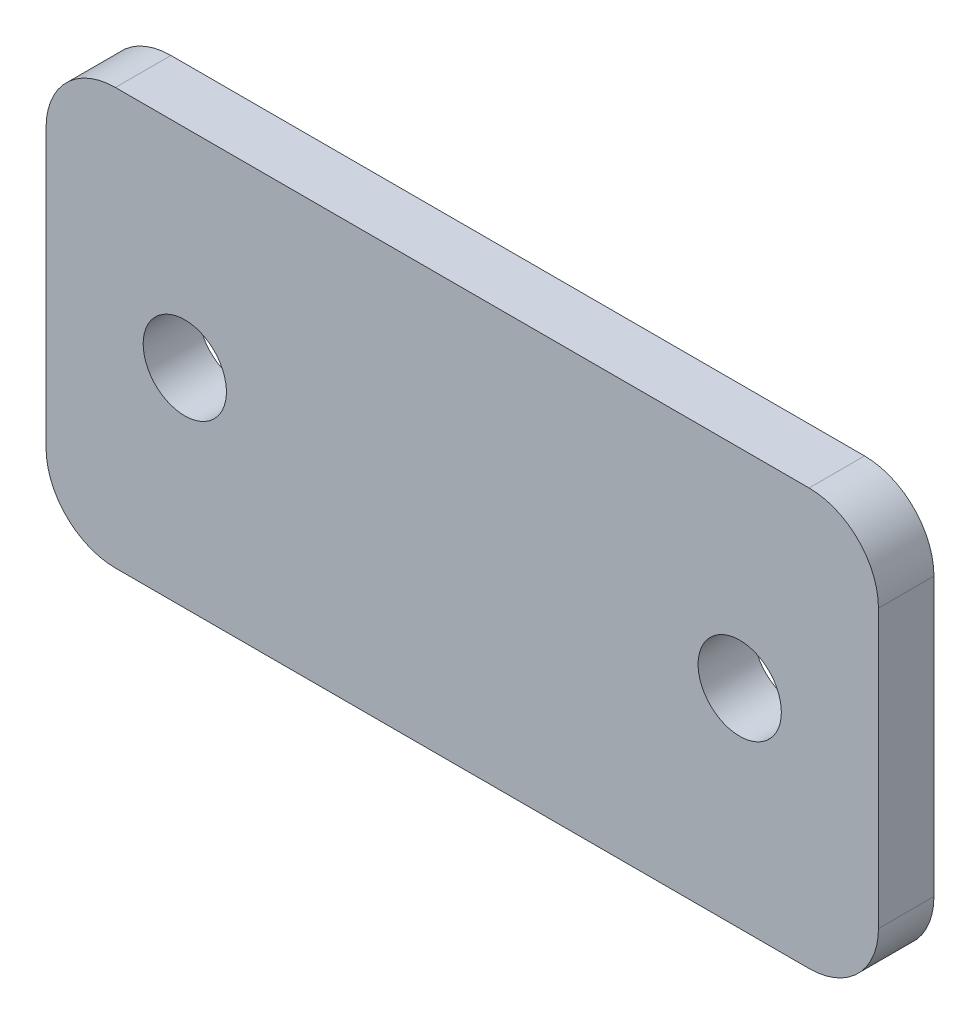
ISO-10303-21;
HEADER;
FILE_DESCRIPTION(('STEP AP214'),'2;1');
FILE_NAME('part.step','',(''),(''),'','','');
FILE_SCHEMA(('AUTOMOTIVE_DESIGN { 1 0 10303 214 1 1 1 1 }'));
ENDSEC;
DATA;
#1=APPLICATION_CONTEXT('core data for automotive mechanical design processes');
#2=APPLICATION_PROTOCOL_DEFINITION('international standard','automotive_design',2000,#1);
#3=PRODUCT_CONTEXT('',#1,'mechanical');
#4=PRODUCT('Part','Part','',(#3));
#5=PRODUCT_RELATED_PRODUCT_CATEGORY('part','',(#4));
#6=PRODUCT_DEFINITION_FORMATION('','',#4);
#7=PRODUCT_DEFINITION_CONTEXT('part definition',#1,'design');
#8=PRODUCT_DEFINITION('design','',#6,#7);
#9=PRODUCT_DEFINITION_SHAPE('','',#8);
#10=(LENGTH_UNIT() NAMED_UNIT(*) SI_UNIT(.MILLI.,.METRE.));
#11=(NAMED_UNIT(*) PLANE_ANGLE_UNIT() SI_UNIT($,.RADIAN.));
#12=(NAMED_UNIT(*) SI_UNIT($,.STERADIAN.) SOLID_ANGLE_UNIT());
#13=UNCERTAINTY_MEASURE_WITH_UNIT(LENGTH_MEASURE(1.E-05),#10,'distance_accuracy_value','');
#14=(GEOMETRIC_REPRESENTATION_CONTEXT(3) GLOBAL_UNCERTAINTY_ASSIGNED_CONTEXT((#13)) GLOBAL_UNIT_ASSIGNED_CONTEXT((#10,
#11,#12)) REPRESENTATION_CONTEXT('',''));
#15=CARTESIAN_POINT('',(0.,0.,0.));
#16=DIRECTION('',(0.,0.,1.));
#17=DIRECTION('',(1.,0.,0.));
#18=AXIS2_PLACEMENT_3D('',#15,#16,#17);
#19=CARTESIAN_POINT('',(-12.5,2.5,2.));
#20=DIRECTION('',(0.,0.,1.));
#21=DIRECTION('',(1.,0.,0.));
#22=AXIS2_PLACEMENT_3D('',#19,#20,#21);
#23=PLANE('',#22);
#24=CARTESIAN_POINT('',(10.,7.5,2.));
#25=DIRECTION('',(0.,0.,1.));
#26=DIRECTION('',(1.,0.,0.));
#27=AXIS2_PLACEMENT_3D('',#24,#25,#26);
#28=CIRCLE('',#27,1.5);
#29=CARTESIAN_POINT('',(11.5,7.5,2.));
#30=VERTEX_POINT('',#29);
#31=EDGE_CURVE('E134',#30,#30,#28,.T.);
#32=ORIENTED_EDGE('',*,*,#31,.F.);
#33=EDGE_LOOP('',(#32));
#34=FACE_BOUND('',#33,.T.);
#35=CARTESIAN_POINT('',(-12.5,2.5,2.));
#36=DIRECTION('',(0.,0.,1.));
#37=DIRECTION('',(1.,0.,0.));
#38=AXIS2_PLACEMENT_3D('',#35,#36,#37);
#39=CIRCLE('',#38,2.5);
#40=CARTESIAN_POINT('',(-15.,2.5,2.));
#41=VERTEX_POINT('',#40);
#42=CARTESIAN_POINT('',(-12.5,0.,2.));
#43=VERTEX_POINT('',#42);
#44=EDGE_CURVE('E145',#41,#43,#39,.T.);
#45=ORIENTED_EDGE('',*,*,#44,.T.);
#46=DIRECTION('',(1.,0.,0.));
#47=VECTOR('',#46,1.);
#48=CARTESIAN_POINT('',(-12.5,0.,2.));
#49=LINE('',#48,#47);
#50=CARTESIAN_POINT('',(12.5,0.,2.));
#51=VERTEX_POINT('',#50);
#52=EDGE_CURVE('E93',#43,#51,#49,.T.);
#53=ORIENTED_EDGE('',*,*,#52,.T.);
#54=CARTESIAN_POINT('',(12.5,2.5,2.));
#55=DIRECTION('',(0.,0.,1.));
#56=DIRECTION('',(1.,0.,0.));
#57=AXIS2_PLACEMENT_3D('',#54,#55,#56);
#58=CIRCLE('',#57,2.5);
#59=CARTESIAN_POINT('',(15.,2.5,2.));
#60=VERTEX_POINT('',#59);
#61=EDGE_CURVE('E160',#51,#60,#58,.T.);
#62=ORIENTED_EDGE('',*,*,#61,.T.);
#63=DIRECTION('',(0.,1.,0.));
#64=VECTOR('',#63,1.);
#65=CARTESIAN_POINT('',(15.,12.5,2.));
#66=LINE('',#65,#64);
#67=CARTESIAN_POINT('',(15.,12.5,2.));
#68=VERTEX_POINT('',#67);
#69=EDGE_CURVE('E173',#60,#68,#66,.T.);
#70=ORIENTED_EDGE('',*,*,#69,.T.);
#71=CARTESIAN_POINT('',(12.5,12.5,2.));
#72=DIRECTION('',(0.,0.,1.));
#73=DIRECTION('',(1.,0.,0.));
#74=AXIS2_PLACEMENT_3D('',#71,#72,#73);
#75=CIRCLE('',#74,2.5);
#76=CARTESIAN_POINT('',(12.5,15.,2.));
#77=VERTEX_POINT('',#76);
#78=EDGE_CURVE('E112',#68,#77,#75,.T.);
#79=ORIENTED_EDGE('',*,*,#78,.T.);
#80=DIRECTION('',(-1.,0.,0.));
#81=VECTOR('',#80,1.);
#82=CARTESIAN_POINT('',(-12.5,15.,2.));
#83=LINE('',#82,#81);
#84=CARTESIAN_POINT('',(-12.5,15.,2.));
#85=VERTEX_POINT('',#84);
#86=EDGE_CURVE('E106',#77,#85,#83,.T.);
#87=ORIENTED_EDGE('',*,*,#86,.T.);
#88=CARTESIAN_POINT('',(-12.5,12.5,2.));
#89=DIRECTION('',(0.,0.,1.));
#90=DIRECTION('',(1.,0.,0.));
#91=AXIS2_PLACEMENT_3D('',#88,#89,#90);
#92=CIRCLE('',#91,2.5);
#93=CARTESIAN_POINT('',(-15.,12.5,2.));
#94=VERTEX_POINT('',#93);
#95=EDGE_CURVE('E110',#85,#94,#92,.T.);
#96=ORIENTED_EDGE('',*,*,#95,.T.);
#97=DIRECTION('',(0.,-1.,0.));
#98=VECTOR('',#97,1.);
#99=CARTESIAN_POINT('',(-15.,12.5,2.));
#100=LINE('',#99,#98);
#101=EDGE_CURVE('E50',#94,#41,#100,.T.);
#102=ORIENTED_EDGE('',*,*,#101,.T.);
#103=EDGE_LOOP('',(#45,#53,#62,#70,#79,#87,#96,#102));
#104=FACE_BOUND('',#103,.T.);
#105=CARTESIAN_POINT('',(-10.,7.5,2.));
#106=DIRECTION('',(0.,0.,1.));
#107=DIRECTION('',(-1.,0.,0.));
#108=AXIS2_PLACEMENT_3D('',#105,#106,#107);
#109=CIRCLE('',#108,1.5);
#110=CARTESIAN_POINT('',(-11.5,7.5,2.));
#111=VERTEX_POINT('',#110);
#112=EDGE_CURVE('E182',#111,#111,#109,.T.);
#113=ORIENTED_EDGE('',*,*,#112,.F.);
#114=EDGE_LOOP('',(#113));
#115=FACE_BOUND('',#114,.T.);
#116=ADVANCED_FACE('F33',(#34,#104,#115),#23,.T.);
#117=CARTESIAN_POINT('',(-12.5,2.5,0.));
#118=DIRECTION('',(0.,0.,1.));
#119=DIRECTION('',(1.,0.,0.));
#120=AXIS2_PLACEMENT_3D('',#117,#118,#119);
#121=PLANE('',#120);
#122=CARTESIAN_POINT('',(-12.5,2.5,0.));
#123=DIRECTION('',(0.,0.,1.));
#124=DIRECTION('',(1.,0.,0.));
#125=AXIS2_PLACEMENT_3D('',#122,#123,#124);
#126=CIRCLE('',#125,2.5);
#127=CARTESIAN_POINT('',(-15.,2.5,0.));
#128=VERTEX_POINT('',#127);
#129=CARTESIAN_POINT('',(-12.5,0.,0.));
#130=VERTEX_POINT('',#129);
#131=EDGE_CURVE('E130',#128,#130,#126,.T.);
#132=ORIENTED_EDGE('',*,*,#131,.F.);
#133=DIRECTION('',(0.,-1.,0.));
#134=VECTOR('',#133,1.);
#135=CARTESIAN_POINT('',(-15.,12.5,0.));
#136=LINE('',#135,#134);
#137=CARTESIAN_POINT('',(-15.,12.5,0.));
#138=VERTEX_POINT('',#137);
#139=EDGE_CURVE('E85',#138,#128,#136,.T.);
#140=ORIENTED_EDGE('',*,*,#139,.F.);
#141=CARTESIAN_POINT('',(-12.5,12.5,0.));
#142=DIRECTION('',(0.,0.,1.));
#143=DIRECTION('',(1.,0.,0.));
#144=AXIS2_PLACEMENT_3D('',#141,#142,#143);
#145=CIRCLE('',#144,2.5);
#146=CARTESIAN_POINT('',(-12.5,15.,0.));
#147=VERTEX_POINT('',#146);
#148=EDGE_CURVE('E79',#147,#138,#145,.T.);
#149=ORIENTED_EDGE('',*,*,#148,.F.);
#150=DIRECTION('',(-1.,0.,0.));
#151=VECTOR('',#150,1.);
#152=CARTESIAN_POINT('',(-12.5,15.,0.));
#153=LINE('',#152,#151);
#154=CARTESIAN_POINT('',(12.5,15.,0.));
#155=VERTEX_POINT('',#154);
#156=EDGE_CURVE('E120',#155,#147,#153,.T.);
#157=ORIENTED_EDGE('',*,*,#156,.F.);
#158=CARTESIAN_POINT('',(12.5,12.5,0.));
#159=DIRECTION('',(0.,0.,1.));
#160=DIRECTION('',(1.,0.,0.));
#161=AXIS2_PLACEMENT_3D('',#158,#159,#160);
#162=CIRCLE('',#161,2.5);
#163=CARTESIAN_POINT('',(15.,12.5,0.));
#164=VERTEX_POINT('',#163);
#165=EDGE_CURVE('E140',#164,#155,#162,.T.);
#166=ORIENTED_EDGE('',*,*,#165,.F.);
#167=DIRECTION('',(0.,1.,0.));
#168=VECTOR('',#167,1.);
#169=CARTESIAN_POINT('',(15.,12.5,0.));
#170=LINE('',#169,#168);
#171=CARTESIAN_POINT('',(15.,2.5,0.));
#172=VERTEX_POINT('',#171);
#173=EDGE_CURVE('E138',#172,#164,#170,.T.);
#174=ORIENTED_EDGE('',*,*,#173,.F.);
#175=CARTESIAN_POINT('',(12.5,2.5,0.));
#176=DIRECTION('',(0.,0.,1.));
#177=DIRECTION('',(1.,0.,0.));
#178=AXIS2_PLACEMENT_3D('',#175,#176,#177);
#179=CIRCLE('',#178,2.5);
#180=CARTESIAN_POINT('',(12.5,0.,0.));
#181=VERTEX_POINT('',#180);
#182=EDGE_CURVE('E136',#181,#172,#179,.T.);
#183=ORIENTED_EDGE('',*,*,#182,.F.);
#184=DIRECTION('',(1.,0.,0.));
#185=VECTOR('',#184,1.);
#186=CARTESIAN_POINT('',(-12.5,0.,0.));
#187=LINE('',#186,#185);
#188=EDGE_CURVE('E133',#130,#181,#187,.T.);
#189=ORIENTED_EDGE('',*,*,#188,.F.);
#190=EDGE_LOOP('',(#132,#140,#149,#157,#166,#174,#183,#189));
#191=FACE_BOUND('',#190,.T.);
#192=CARTESIAN_POINT('',(10.,7.5,0.));
#193=DIRECTION('',(0.,0.,1.));
#194=DIRECTION('',(1.,0.,0.));
#195=AXIS2_PLACEMENT_3D('',#192,#193,#194);
#196=CIRCLE('',#195,1.5);
#197=CARTESIAN_POINT('',(11.5,7.5,0.));
#198=VERTEX_POINT('',#197);
#199=EDGE_CURVE('E179',#198,#198,#196,.T.);
#200=ORIENTED_EDGE('',*,*,#199,.T.);
#201=EDGE_LOOP('',(#200));
#202=FACE_BOUND('',#201,.T.);
#203=CARTESIAN_POINT('',(-10.,7.5,0.));
#204=DIRECTION('',(0.,0.,1.));
#205=DIRECTION('',(-1.,0.,0.));
#206=AXIS2_PLACEMENT_3D('',#203,#204,#205);
#207=CIRCLE('',#206,1.5);
#208=CARTESIAN_POINT('',(-11.5,7.5,0.));
#209=VERTEX_POINT('',#208);
#210=EDGE_CURVE('E185',#209,#209,#207,.T.);
#211=ORIENTED_EDGE('',*,*,#210,.T.);
#212=EDGE_LOOP('',(#211));
#213=FACE_BOUND('',#212,.T.);
#214=ADVANCED_FACE('F164',(#191,#202,#213),#121,.F.);
#215=CARTESIAN_POINT('',(-12.5,2.5,2.));
#216=DIRECTION('',(0.,0.,-1.));
#217=DIRECTION('',(-1.,0.,0.));
#218=AXIS2_PLACEMENT_3D('',#215,#216,#217);
#219=CYLINDRICAL_SURFACE('',#218,2.5);
#220=ORIENTED_EDGE('',*,*,#131,.T.);
#221=DIRECTION('',(0.,0.,-1.));
#222=VECTOR('',#221,1.);
#223=CARTESIAN_POINT('',(-12.5,0.,2.));
#224=LINE('',#223,#222);
#225=EDGE_CURVE('E11',#43,#130,#224,.T.);
#226=ORIENTED_EDGE('',*,*,#225,.F.);
#227=ORIENTED_EDGE('',*,*,#44,.F.);
#228=DIRECTION('',(0.,0.,-1.));
#229=VECTOR('',#228,1.);
#230=CARTESIAN_POINT('',(-15.,2.5,2.));
#231=LINE('',#230,#229);
#232=EDGE_CURVE('E126',#41,#128,#231,.T.);
#233=ORIENTED_EDGE('',*,*,#232,.T.);
#234=EDGE_LOOP('',(#220,#226,#227,#233));
#235=FACE_BOUND('',#234,.T.);
#236=ADVANCED_FACE('F35',(#235),#219,.T.);
#237=CARTESIAN_POINT('',(-12.5,0.,2.));
#238=DIRECTION('',(0.,1.,0.));
#239=DIRECTION('',(0.,0.,1.));
#240=AXIS2_PLACEMENT_3D('',#237,#238,#239);
#241=PLANE('',#240);
#242=ORIENTED_EDGE('',*,*,#188,.T.);
#243=DIRECTION('',(0.,0.,-1.));
#244=VECTOR('',#243,1.);
#245=CARTESIAN_POINT('',(12.5,0.,2.));
#246=LINE('',#245,#244);
#247=EDGE_CURVE('E42',#51,#181,#246,.T.);
#248=ORIENTED_EDGE('',*,*,#247,.F.);
#249=ORIENTED_EDGE('',*,*,#52,.F.);
#250=ORIENTED_EDGE('',*,*,#225,.T.);
#251=EDGE_LOOP('',(#242,#248,#249,#250));
#252=FACE_BOUND('',#251,.T.);
#253=ADVANCED_FACE('F217',(#252),#241,.F.);
#254=CARTESIAN_POINT('',(12.5,2.5,2.));
#255=DIRECTION('',(0.,0.,-1.));
#256=DIRECTION('',(-1.,0.,0.));
#257=AXIS2_PLACEMENT_3D('',#254,#255,#256);
#258=CYLINDRICAL_SURFACE('',#257,2.5);
#259=ORIENTED_EDGE('',*,*,#182,.T.);
#260=DIRECTION('',(0.,0.,-1.));
#261=VECTOR('',#260,1.);
#262=CARTESIAN_POINT('',(15.,2.5,2.));
#263=LINE('',#262,#261);
#264=EDGE_CURVE('E152',#60,#172,#263,.T.);
#265=ORIENTED_EDGE('',*,*,#264,.F.);
#266=ORIENTED_EDGE('',*,*,#61,.F.);
#267=ORIENTED_EDGE('',*,*,#247,.T.);
#268=EDGE_LOOP('',(#259,#265,#266,#267));
#269=FACE_BOUND('',#268,.T.);
#270=ADVANCED_FACE('F158',(#269),#258,.T.);
#271=CARTESIAN_POINT('',(15.,12.5,2.));
#272=DIRECTION('',(-1.,0.,0.));
#273=DIRECTION('',(0.,0.,1.));
#274=AXIS2_PLACEMENT_3D('',#271,#272,#273);
#275=PLANE('',#274);
#276=ORIENTED_EDGE('',*,*,#173,.T.);
#277=DIRECTION('',(0.,0.,-1.));
#278=VECTOR('',#277,1.);
#279=CARTESIAN_POINT('',(15.,12.5,2.));
#280=LINE('',#279,#278);
#281=EDGE_CURVE('E149',#68,#164,#280,.T.);
#282=ORIENTED_EDGE('',*,*,#281,.F.);
#283=ORIENTED_EDGE('',*,*,#69,.F.);
#284=ORIENTED_EDGE('',*,*,#264,.T.);
#285=EDGE_LOOP('',(#276,#282,#283,#284));
#286=FACE_BOUND('',#285,.T.);
#287=ADVANCED_FACE('F169',(#286),#275,.F.);
#288=CARTESIAN_POINT('',(12.5,12.5,2.));
#289=DIRECTION('',(0.,0.,-1.));
#290=DIRECTION('',(-1.,0.,0.));
#291=AXIS2_PLACEMENT_3D('',#288,#289,#290);
#292=CYLINDRICAL_SURFACE('',#291,2.5);
#293=ORIENTED_EDGE('',*,*,#165,.T.);
#294=DIRECTION('',(0.,0.,-1.));
#295=VECTOR('',#294,1.);
#296=CARTESIAN_POINT('',(12.5,15.,2.));
#297=LINE('',#296,#295);
#298=EDGE_CURVE('E121',#77,#155,#297,.T.);
#299=ORIENTED_EDGE('',*,*,#298,.F.);
#300=ORIENTED_EDGE('',*,*,#78,.F.);
#301=ORIENTED_EDGE('',*,*,#281,.T.);
#302=EDGE_LOOP('',(#293,#299,#300,#301));
#303=FACE_BOUND('',#302,.T.);
#304=ADVANCED_FACE('F172',(#303),#292,.T.);
#305=CARTESIAN_POINT('',(-12.5,15.,2.));
#306=DIRECTION('',(0.,-1.,0.));
#307=DIRECTION('',(0.,0.,-1.));
#308=AXIS2_PLACEMENT_3D('',#305,#306,#307);
#309=PLANE('',#308);
#310=ORIENTED_EDGE('',*,*,#156,.T.);
#311=DIRECTION('',(0.,0.,-1.));
#312=VECTOR('',#311,1.);
#313=CARTESIAN_POINT('',(-12.5,15.,2.));
#314=LINE('',#313,#312);
#315=EDGE_CURVE('E117',#85,#147,#314,.T.);
#316=ORIENTED_EDGE('',*,*,#315,.F.);
#317=ORIENTED_EDGE('',*,*,#86,.F.);
#318=ORIENTED_EDGE('',*,*,#298,.T.);
#319=EDGE_LOOP('',(#310,#316,#317,#318));
#320=FACE_BOUND('',#319,.T.);
#321=ADVANCED_FACE('F118',(#320),#309,.F.);
#322=CARTESIAN_POINT('',(-12.5,12.5,2.));
#323=DIRECTION('',(0.,0.,-1.));
#324=DIRECTION('',(-1.,0.,0.));
#325=AXIS2_PLACEMENT_3D('',#322,#323,#324);
#326=CYLINDRICAL_SURFACE('',#325,2.5);
#327=ORIENTED_EDGE('',*,*,#148,.T.);
#328=DIRECTION('',(0.,0.,-1.));
#329=VECTOR('',#328,1.);
#330=CARTESIAN_POINT('',(-15.,12.5,2.));
#331=LINE('',#330,#329);
#332=EDGE_CURVE('E122',#94,#138,#331,.T.);
#333=ORIENTED_EDGE('',*,*,#332,.F.);
#334=ORIENTED_EDGE('',*,*,#95,.F.);
#335=ORIENTED_EDGE('',*,*,#315,.T.);
#336=EDGE_LOOP('',(#327,#333,#334,#335));
#337=FACE_BOUND('',#336,.T.);
#338=ADVANCED_FACE('F124',(#337),#326,.T.);
#339=CARTESIAN_POINT('',(-15.,12.5,2.));
#340=DIRECTION('',(1.,0.,0.));
#341=DIRECTION('',(0.,0.,-1.));
#342=AXIS2_PLACEMENT_3D('',#339,#340,#341);
#343=PLANE('',#342);
#344=ORIENTED_EDGE('',*,*,#139,.T.);
#345=ORIENTED_EDGE('',*,*,#232,.F.);
#346=ORIENTED_EDGE('',*,*,#101,.F.);
#347=ORIENTED_EDGE('',*,*,#332,.T.);
#348=EDGE_LOOP('',(#344,#345,#346,#347));
#349=FACE_BOUND('',#348,.T.);
#350=ADVANCED_FACE('F205',(#349),#343,.F.);
#351=CARTESIAN_POINT('',(10.,7.5,2.));
#352=DIRECTION('',(0.,0.,-1.));
#353=DIRECTION('',(-1.,0.,0.));
#354=AXIS2_PLACEMENT_3D('',#351,#352,#353);
#355=CYLINDRICAL_SURFACE('',#354,1.5);
#356=ORIENTED_EDGE('',*,*,#31,.T.);
#357=EDGE_LOOP('',(#356));
#358=FACE_BOUND('',#357,.T.);
#359=ORIENTED_EDGE('',*,*,#199,.F.);
#360=EDGE_LOOP('',(#359));
#361=FACE_BOUND('',#360,.T.);
#362=ADVANCED_FACE('F202',(#358,#361),#355,.F.);
#363=CARTESIAN_POINT('',(-10.,7.5,2.));
#364=DIRECTION('',(0.,0.,-1.));
#365=DIRECTION('',(-1.,0.,0.));
#366=AXIS2_PLACEMENT_3D('',#363,#364,#365);
#367=CYLINDRICAL_SURFACE('',#366,1.5);
#368=ORIENTED_EDGE('',*,*,#112,.T.);
#369=EDGE_LOOP('',(#368));
#370=FACE_BOUND('',#369,.T.);
#371=ORIENTED_EDGE('',*,*,#210,.F.);
#372=EDGE_LOOP('',(#371));
#373=FACE_BOUND('',#372,.T.);
#374=ADVANCED_FACE('F191',(#370,#373),#367,.F.);
#375=CLOSED_SHELL('',(#116,#214,#236,#253,#270,#287,#304,#321,#338,#350,#362,#374));
#376=MANIFOLD_SOLID_BREP('B2',#375);
#377=ADVANCED_BREP_SHAPE_REPRESENTATION('',(#18,#376),#14);
#378=SHAPE_DEFINITION_REPRESENTATION(#9,#377);
ENDSEC;
END-ISO-10303-21;
